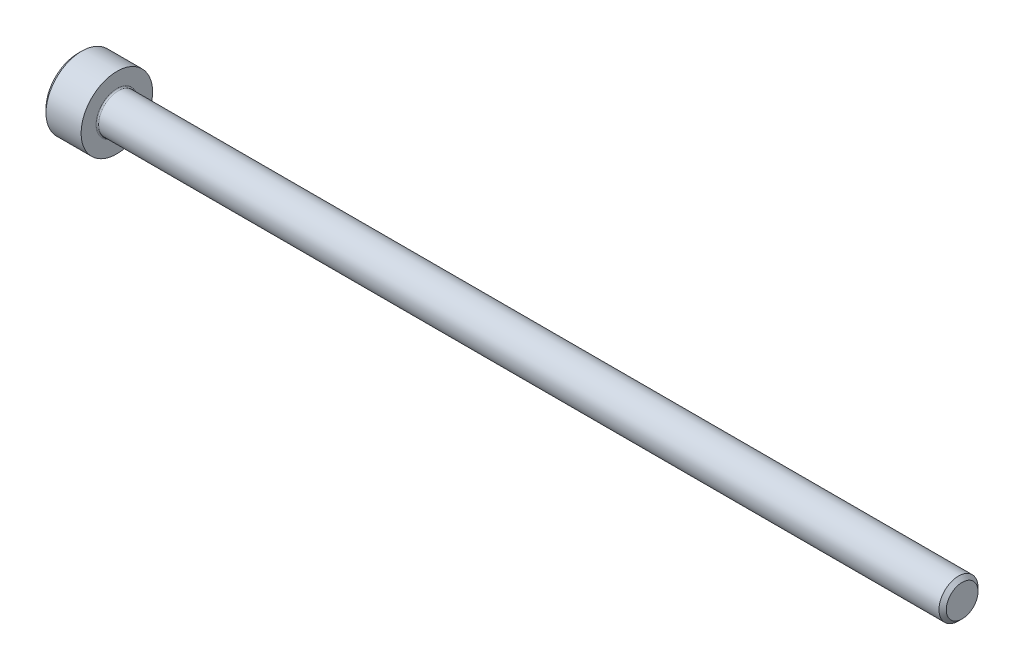
ISO-10303-21;
HEADER;
FILE_DESCRIPTION(('STEP AP214'),'2;1');
FILE_NAME('part.step','',(''),(''),'','','');
FILE_SCHEMA(('AUTOMOTIVE_DESIGN { 1 0 10303 214 1 1 1 1 }'));
ENDSEC;
DATA;
#1=APPLICATION_CONTEXT('core data for automotive mechanical design processes');
#2=APPLICATION_PROTOCOL_DEFINITION('international standard','automotive_design',2000,#1);
#3=PRODUCT_CONTEXT('',#1,'mechanical');
#4=PRODUCT('Part','Part','',(#3));
#5=PRODUCT_RELATED_PRODUCT_CATEGORY('part','',(#4));
#6=PRODUCT_DEFINITION_FORMATION('','',#4);
#7=PRODUCT_DEFINITION_CONTEXT('part definition',#1,'design');
#8=PRODUCT_DEFINITION('design','',#6,#7);
#9=PRODUCT_DEFINITION_SHAPE('','',#8);
#10=(LENGTH_UNIT() NAMED_UNIT(*) SI_UNIT(.MILLI.,.METRE.));
#11=(NAMED_UNIT(*) PLANE_ANGLE_UNIT() SI_UNIT($,.RADIAN.));
#12=(NAMED_UNIT(*) SI_UNIT($,.STERADIAN.) SOLID_ANGLE_UNIT());
#13=UNCERTAINTY_MEASURE_WITH_UNIT(LENGTH_MEASURE(1.E-05),#10,'distance_accuracy_value','');
#14=(GEOMETRIC_REPRESENTATION_CONTEXT(3) GLOBAL_UNCERTAINTY_ASSIGNED_CONTEXT((#13)) GLOBAL_UNIT_ASSIGNED_CONTEXT((#10,
#11,#12)) REPRESENTATION_CONTEXT('',''));
#15=CARTESIAN_POINT('',(0.,0.,0.));
#16=DIRECTION('',(0.,0.,1.));
#17=DIRECTION('',(1.,0.,0.));
#18=AXIS2_PLACEMENT_3D('',#15,#16,#17);
#19=CARTESIAN_POINT('',(0.,0.,0.));
#20=DIRECTION('',(-1.,0.,0.));
#21=DIRECTION('',(0.,0.,1.));
#22=AXIS2_PLACEMENT_3D('',#19,#20,#21);
#23=PLANE('',#22);
#24=DIRECTION('',(0.,-0.499999999999998,0.866025403784439));
#25=VECTOR('',#24,1.);
#26=CARTESIAN_POINT('',(0.,1.47801668912544,0.));
#27=LINE('',#26,#25);
#28=CARTESIAN_POINT('',(0.,1.47801668912544,0.));
#29=VERTEX_POINT('',#28);
#30=CARTESIAN_POINT('',(0.,0.739008344562719,1.28));
#31=VERTEX_POINT('',#30);
#32=EDGE_CURVE('E433',#29,#31,#27,.T.);
#33=ORIENTED_EDGE('',*,*,#32,.T.);
#34=DIRECTION('',(0.,1.,0.));
#35=VECTOR('',#34,1.);
#36=CARTESIAN_POINT('',(0.,-0.739008344562722,1.28));
#37=LINE('',#36,#35);
#38=CARTESIAN_POINT('',(0.,-0.739008344562722,1.28));
#39=VERTEX_POINT('',#38);
#40=EDGE_CURVE('E152',#39,#31,#37,.T.);
#41=ORIENTED_EDGE('',*,*,#40,.F.);
#42=DIRECTION('',(0.,-0.500000000000001,-0.866025403784438));
#43=VECTOR('',#42,1.);
#44=CARTESIAN_POINT('',(0.,-0.739008344562722,1.28));
#45=LINE('',#44,#43);
#46=CARTESIAN_POINT('',(0.,-1.47801668912544,0.));
#47=VERTEX_POINT('',#46);
#48=EDGE_CURVE('E438',#39,#47,#45,.T.);
#49=ORIENTED_EDGE('',*,*,#48,.T.);
#50=DIRECTION('',(0.,0.499999999999998,-0.86602540378444));
#51=VECTOR('',#50,1.);
#52=CARTESIAN_POINT('',(0.,-1.47801668912544,0.));
#53=LINE('',#52,#51);
#54=CARTESIAN_POINT('',(0.,-0.739008344562727,-1.28));
#55=VERTEX_POINT('',#54);
#56=EDGE_CURVE('E442',#47,#55,#53,.T.);
#57=ORIENTED_EDGE('',*,*,#56,.T.);
#58=DIRECTION('',(0.,-1.,0.));
#59=VECTOR('',#58,1.);
#60=CARTESIAN_POINT('',(0.,0.739008344562715,-1.28));
#61=LINE('',#60,#59);
#62=CARTESIAN_POINT('',(0.,0.739008344562715,-1.28));
#63=VERTEX_POINT('',#62);
#64=EDGE_CURVE('E446',#63,#55,#61,.T.);
#65=ORIENTED_EDGE('',*,*,#64,.F.);
#66=DIRECTION('',(0.,-0.500000000000001,-0.866025403784438));
#67=VECTOR('',#66,1.);
#68=CARTESIAN_POINT('',(0.,1.47801668912544,0.));
#69=LINE('',#68,#67);
#70=EDGE_CURVE('E147',#29,#63,#69,.T.);
#71=ORIENTED_EDGE('',*,*,#70,.F.);
#72=EDGE_LOOP('',(#33,#41,#49,#57,#65,#71));
#73=FACE_BOUND('',#72,.T.);
#74=CARTESIAN_POINT('',(0.,0.,0.));
#75=DIRECTION('',(-1.,0.,0.));
#76=DIRECTION('',(0.,0.,1.));
#77=AXIS2_PLACEMENT_3D('',#74,#75,#76);
#78=CIRCLE('',#77,2.45);
#79=CARTESIAN_POINT('',(0.,0.,2.45));
#80=VERTEX_POINT('',#79);
#81=EDGE_CURVE('E168',#80,#80,#78,.T.);
#82=ORIENTED_EDGE('',*,*,#81,.T.);
#83=EDGE_LOOP('',(#82));
#84=FACE_BOUND('',#83,.T.);
#85=ADVANCED_FACE('F38',(#73,#84),#23,.T.);
#86=CARTESIAN_POINT('',(68.,1.2195,0.));
#87=DIRECTION('',(1.,0.,0.));
#88=DIRECTION('',(0.,0.,-1.));
#89=AXIS2_PLACEMENT_3D('',#86,#87,#88);
#90=PLANE('',#89);
#91=CARTESIAN_POINT('',(68.,0.,0.));
#92=DIRECTION('',(-1.,0.,0.));
#93=DIRECTION('',(0.,0.,1.));
#94=AXIS2_PLACEMENT_3D('',#91,#92,#93);
#95=CIRCLE('',#94,1.2195);
#96=CARTESIAN_POINT('',(68.,0.,1.2195));
#97=VERTEX_POINT('',#96);
#98=EDGE_CURVE('E185',#97,#97,#95,.T.);
#99=ORIENTED_EDGE('',*,*,#98,.F.);
#100=EDGE_LOOP('',(#99));
#101=FACE_BOUND('',#100,.T.);
#102=ADVANCED_FACE('F207',(#101),#90,.T.);
#103=CARTESIAN_POINT('',(68.,0.,0.));
#104=DIRECTION('',(-1.,0.,0.));
#105=DIRECTION('',(0.,0.,1.));
#106=AXIS2_PLACEMENT_3D('',#103,#104,#105);
#107=CONICAL_SURFACE('',#106,1.2195,0.785398163396707);
#108=CARTESIAN_POINT('',(67.7194999999998,0.,0.));
#109=DIRECTION('',(-1.,0.,0.));
#110=DIRECTION('',(0.,0.,1.));
#111=AXIS2_PLACEMENT_3D('',#108,#109,#110);
#112=CIRCLE('',#111,1.49999999999978);
#113=CARTESIAN_POINT('',(67.7194999999998,0.,1.49999999999978));
#114=VERTEX_POINT('',#113);
#115=EDGE_CURVE('E181',#114,#114,#112,.T.);
#116=ORIENTED_EDGE('',*,*,#115,.F.);
#117=EDGE_LOOP('',(#116));
#118=FACE_BOUND('',#117,.T.);
#119=ORIENTED_EDGE('',*,*,#98,.T.);
#120=EDGE_LOOP('',(#119));
#121=FACE_BOUND('',#120,.T.);
#122=ADVANCED_FACE('F213',(#118,#121),#107,.T.);
#123=CARTESIAN_POINT('',(-31.75,0.,0.));
#124=DIRECTION('',(-1.,0.,0.));
#125=DIRECTION('',(0.,0.,1.));
#126=AXIS2_PLACEMENT_3D('',#123,#124,#125);
#127=CYLINDRICAL_SURFACE('',#126,1.49999999999989);
#128=CARTESIAN_POINT('',(3.1,0.,0.));
#129=DIRECTION('',(1.,0.,0.));
#130=DIRECTION('',(0.,0.,-1.));
#131=AXIS2_PLACEMENT_3D('',#128,#129,#130);
#132=CIRCLE('',#131,1.49999999999989);
#133=CARTESIAN_POINT('',(3.1,0.,-1.49999999999989));
#134=VERTEX_POINT('',#133);
#135=EDGE_CURVE('E11',#134,#134,#132,.T.);
#136=ORIENTED_EDGE('',*,*,#135,.T.);
#137=EDGE_LOOP('',(#136));
#138=FACE_BOUND('',#137,.T.);
#139=ORIENTED_EDGE('',*,*,#115,.T.);
#140=EDGE_LOOP('',(#139));
#141=FACE_BOUND('',#140,.T.);
#142=ADVANCED_FACE('F224',(#138,#141),#127,.T.);
#143=CARTESIAN_POINT('',(3.,2.75,0.));
#144=DIRECTION('',(1.,0.,0.));
#145=DIRECTION('',(0.,0.,-1.));
#146=AXIS2_PLACEMENT_3D('',#143,#144,#145);
#147=PLANE('',#146);
#148=CARTESIAN_POINT('',(3.,0.,0.));
#149=DIRECTION('',(1.,0.,0.));
#150=DIRECTION('',(0.,0.,-1.));
#151=AXIS2_PLACEMENT_3D('',#148,#149,#150);
#152=CIRCLE('',#151,1.59999999999989);
#153=CARTESIAN_POINT('',(3.,0.,-1.59999999999989));
#154=VERTEX_POINT('',#153);
#155=EDGE_CURVE('E47',#154,#154,#152,.F.);
#156=ORIENTED_EDGE('',*,*,#155,.T.);
#157=EDGE_LOOP('',(#156));
#158=FACE_BOUND('',#157,.T.);
#159=CARTESIAN_POINT('',(3.,0.,0.));
#160=DIRECTION('',(-1.,0.,0.));
#161=DIRECTION('',(0.,0.,1.));
#162=AXIS2_PLACEMENT_3D('',#159,#160,#161);
#163=CIRCLE('',#162,2.75);
#164=CARTESIAN_POINT('',(3.,0.,2.75));
#165=VERTEX_POINT('',#164);
#166=EDGE_CURVE('E177',#165,#165,#163,.T.);
#167=ORIENTED_EDGE('',*,*,#166,.F.);
#168=EDGE_LOOP('',(#167));
#169=FACE_BOUND('',#168,.T.);
#170=ADVANCED_FACE('F191',(#158,#169),#147,.T.);
#171=CARTESIAN_POINT('',(-31.75,0.,0.));
#172=DIRECTION('',(-1.,0.,0.));
#173=DIRECTION('',(0.,0.,1.));
#174=AXIS2_PLACEMENT_3D('',#171,#172,#173);
#175=CYLINDRICAL_SURFACE('',#174,2.75);
#176=ORIENTED_EDGE('',*,*,#166,.T.);
#177=EDGE_LOOP('',(#176));
#178=FACE_BOUND('',#177,.T.);
#179=CARTESIAN_POINT('',(0.300000000000002,0.,0.));
#180=DIRECTION('',(-1.,0.,0.));
#181=DIRECTION('',(0.,0.,1.));
#182=AXIS2_PLACEMENT_3D('',#179,#180,#181);
#183=CIRCLE('',#182,2.75);
#184=CARTESIAN_POINT('',(0.300000000000002,0.,2.75));
#185=VERTEX_POINT('',#184);
#186=EDGE_CURVE('E173',#185,#185,#183,.T.);
#187=ORIENTED_EDGE('',*,*,#186,.F.);
#188=EDGE_LOOP('',(#187));
#189=FACE_BOUND('',#188,.T.);
#190=ADVANCED_FACE('F202',(#178,#189),#175,.T.);
#191=CARTESIAN_POINT('',(0.,0.,0.));
#192=DIRECTION('',(1.,0.,0.));
#193=DIRECTION('',(0.,0.,-1.));
#194=AXIS2_PLACEMENT_3D('',#191,#192,#193);
#195=CONICAL_SURFACE('',#194,2.45,0.785398163397448);
#196=ORIENTED_EDGE('',*,*,#186,.T.);
#197=EDGE_LOOP('',(#196));
#198=FACE_BOUND('',#197,.T.);
#199=ORIENTED_EDGE('',*,*,#81,.F.);
#200=EDGE_LOOP('',(#199));
#201=FACE_BOUND('',#200,.T.);
#202=ADVANCED_FACE('F195',(#198,#201),#195,.T.);
#203=CARTESIAN_POINT('',(3.1,0.,0.));
#204=DIRECTION('',(1.,0.,0.));
#205=DIRECTION('',(0.,0.,-1.));
#206=AXIS2_PLACEMENT_3D('',#203,#204,#205);
#207=TOROIDAL_SURFACE('',#206,1.59999999999989,0.1);
#208=ORIENTED_EDGE('',*,*,#135,.F.);
#209=EDGE_LOOP('',(#208));
#210=FACE_BOUND('',#209,.T.);
#211=ORIENTED_EDGE('',*,*,#155,.F.);
#212=EDGE_LOOP('',(#211));
#213=FACE_BOUND('',#212,.T.);
#214=ADVANCED_FACE('F40',(#210,#213),#207,.F.);
#215=CARTESIAN_POINT('',(1.3,1.47801668912544,0.));
#216=DIRECTION('',(0.,-0.86602540378444,-0.499999999999999));
#217=DIRECTION('',(0.,0.499999999999999,-0.86602540378444));
#218=AXIS2_PLACEMENT_3D('',#215,#216,#217);
#219=PLANE('',#218);
#220=ORIENTED_EDGE('',*,*,#32,.F.);
#221=DIRECTION('',(-1.,0.,0.));
#222=VECTOR('',#221,1.);
#223=CARTESIAN_POINT('',(1.3,1.47801668912544,0.));
#224=LINE('',#223,#222);
#225=CARTESIAN_POINT('',(1.3,1.47801668912544,0.));
#226=VERTEX_POINT('',#225);
#227=EDGE_CURVE('E432',#226,#29,#224,.T.);
#228=ORIENTED_EDGE('',*,*,#227,.F.);
#229=DIRECTION('',(0.,-0.499999999999998,0.866025403784439));
#230=VECTOR('',#229,1.);
#231=CARTESIAN_POINT('',(1.3,1.47801668912544,0.));
#232=LINE('',#231,#230);
#233=CARTESIAN_POINT('',(1.3,1.10851251684408,0.639999999999998));
#234=VERTEX_POINT('',#233);
#235=EDGE_CURVE('E57',#226,#234,#232,.T.);
#236=ORIENTED_EDGE('',*,*,#235,.T.);
#237=CARTESIAN_POINT('',(1.3,0.739008344562719,1.28));
#238=VERTEX_POINT('',#237);
#239=EDGE_CURVE('E131',#234,#238,#232,.T.);
#240=ORIENTED_EDGE('',*,*,#239,.T.);
#241=DIRECTION('',(-1.,0.,0.));
#242=VECTOR('',#241,1.);
#243=CARTESIAN_POINT('',(1.3,0.739008344562719,1.28));
#244=LINE('',#243,#242);
#245=EDGE_CURVE('E144',#238,#31,#244,.T.);
#246=ORIENTED_EDGE('',*,*,#245,.T.);
#247=EDGE_LOOP('',(#220,#228,#236,#240,#246));
#248=FACE_BOUND('',#247,.T.);
#249=ADVANCED_FACE('F143',(#248),#219,.T.);
#250=CARTESIAN_POINT('',(1.3,-0.739008344562722,1.28));
#251=DIRECTION('',(0.,0.,1.));
#252=DIRECTION('',(0.,-1.,0.));
#253=AXIS2_PLACEMENT_3D('',#250,#251,#252);
#254=PLANE('',#253);
#255=ORIENTED_EDGE('',*,*,#40,.T.);
#256=ORIENTED_EDGE('',*,*,#245,.F.);
#257=DIRECTION('',(0.,1.,0.));
#258=VECTOR('',#257,1.);
#259=CARTESIAN_POINT('',(1.3,-0.739008344562722,1.28));
#260=LINE('',#259,#258);
#261=CARTESIAN_POINT('',(1.3,0.,1.28));
#262=VERTEX_POINT('',#261);
#263=EDGE_CURVE('E129',#262,#238,#260,.T.);
#264=ORIENTED_EDGE('',*,*,#263,.F.);
#265=CARTESIAN_POINT('',(1.3,-0.739008344562722,1.28));
#266=VERTEX_POINT('',#265);
#267=EDGE_CURVE('E140',#266,#262,#260,.T.);
#268=ORIENTED_EDGE('',*,*,#267,.F.);
#269=DIRECTION('',(-1.,0.,0.));
#270=VECTOR('',#269,1.);
#271=CARTESIAN_POINT('',(1.3,-0.739008344562722,1.28));
#272=LINE('',#271,#270);
#273=EDGE_CURVE('E155',#266,#39,#272,.T.);
#274=ORIENTED_EDGE('',*,*,#273,.T.);
#275=EDGE_LOOP('',(#255,#256,#264,#268,#274));
#276=FACE_BOUND('',#275,.T.);
#277=ADVANCED_FACE('F149',(#276),#254,.F.);
#278=CARTESIAN_POINT('',(1.3,-0.739008344562722,1.28));
#279=DIRECTION('',(0.,0.866025403784438,-0.500000000000001));
#280=DIRECTION('',(0.,0.500000000000001,0.866025403784438));
#281=AXIS2_PLACEMENT_3D('',#278,#279,#280);
#282=PLANE('',#281);
#283=ORIENTED_EDGE('',*,*,#48,.F.);
#284=ORIENTED_EDGE('',*,*,#273,.F.);
#285=DIRECTION('',(0.,-0.500000000000001,-0.866025403784438));
#286=VECTOR('',#285,1.);
#287=CARTESIAN_POINT('',(1.3,-0.739008344562722,1.28));
#288=LINE('',#287,#286);
#289=CARTESIAN_POINT('',(1.3,-1.10851251684408,0.640000000000002));
#290=VERTEX_POINT('',#289);
#291=EDGE_CURVE('E407',#266,#290,#288,.T.);
#292=ORIENTED_EDGE('',*,*,#291,.T.);
#293=CARTESIAN_POINT('',(1.3,-1.47801668912544,0.));
#294=VERTEX_POINT('',#293);
#295=EDGE_CURVE('E409',#290,#294,#288,.T.);
#296=ORIENTED_EDGE('',*,*,#295,.T.);
#297=DIRECTION('',(-1.,0.,0.));
#298=VECTOR('',#297,1.);
#299=CARTESIAN_POINT('',(1.3,-1.47801668912544,0.));
#300=LINE('',#299,#298);
#301=EDGE_CURVE('E163',#294,#47,#300,.T.);
#302=ORIENTED_EDGE('',*,*,#301,.T.);
#303=EDGE_LOOP('',(#283,#284,#292,#296,#302));
#304=FACE_BOUND('',#303,.T.);
#305=ADVANCED_FACE('F298',(#304),#282,.T.);
#306=CARTESIAN_POINT('',(1.3,-1.47801668912544,0.));
#307=DIRECTION('',(0.,0.86602540378444,0.499999999999998));
#308=DIRECTION('',(0.,-0.499999999999998,0.86602540378444));
#309=AXIS2_PLACEMENT_3D('',#306,#307,#308);
#310=PLANE('',#309);
#311=ORIENTED_EDGE('',*,*,#56,.F.);
#312=ORIENTED_EDGE('',*,*,#301,.F.);
#313=DIRECTION('',(0.,0.499999999999998,-0.86602540378444));
#314=VECTOR('',#313,1.);
#315=CARTESIAN_POINT('',(1.3,-1.47801668912544,0.));
#316=LINE('',#315,#314);
#317=CARTESIAN_POINT('',(1.3,-1.10851251684409,-0.639999999999999));
#318=VERTEX_POINT('',#317);
#319=EDGE_CURVE('E412',#294,#318,#316,.T.);
#320=ORIENTED_EDGE('',*,*,#319,.T.);
#321=CARTESIAN_POINT('',(1.3,-0.739008344562727,-1.28));
#322=VERTEX_POINT('',#321);
#323=EDGE_CURVE('E418',#318,#322,#316,.T.);
#324=ORIENTED_EDGE('',*,*,#323,.T.);
#325=DIRECTION('',(-1.,0.,0.));
#326=VECTOR('',#325,1.);
#327=CARTESIAN_POINT('',(1.3,-0.739008344562727,-1.28));
#328=LINE('',#327,#326);
#329=EDGE_CURVE('E459',#322,#55,#328,.T.);
#330=ORIENTED_EDGE('',*,*,#329,.T.);
#331=EDGE_LOOP('',(#311,#312,#320,#324,#330));
#332=FACE_BOUND('',#331,.T.);
#333=ADVANCED_FACE('F306',(#332),#310,.T.);
#334=CARTESIAN_POINT('',(1.3,0.739008344562715,-1.28));
#335=DIRECTION('',(0.,0.,-1.));
#336=DIRECTION('',(0.,1.,0.));
#337=AXIS2_PLACEMENT_3D('',#334,#335,#336);
#338=PLANE('',#337);
#339=ORIENTED_EDGE('',*,*,#64,.T.);
#340=ORIENTED_EDGE('',*,*,#329,.F.);
#341=DIRECTION('',(0.,-1.,0.));
#342=VECTOR('',#341,1.);
#343=CARTESIAN_POINT('',(1.3,0.739008344562715,-1.28));
#344=LINE('',#343,#342);
#345=CARTESIAN_POINT('',(1.3,0.,-1.28));
#346=VERTEX_POINT('',#345);
#347=EDGE_CURVE('E424',#346,#322,#344,.T.);
#348=ORIENTED_EDGE('',*,*,#347,.F.);
#349=CARTESIAN_POINT('',(1.3,0.739008344562715,-1.28));
#350=VERTEX_POINT('',#349);
#351=EDGE_CURVE('E425',#350,#346,#344,.T.);
#352=ORIENTED_EDGE('',*,*,#351,.F.);
#353=DIRECTION('',(-1.,0.,0.));
#354=VECTOR('',#353,1.);
#355=CARTESIAN_POINT('',(1.3,0.739008344562715,-1.28));
#356=LINE('',#355,#354);
#357=EDGE_CURVE('E455',#350,#63,#356,.T.);
#358=ORIENTED_EDGE('',*,*,#357,.T.);
#359=EDGE_LOOP('',(#339,#340,#348,#352,#358));
#360=FACE_BOUND('',#359,.T.);
#361=ADVANCED_FACE('F315',(#360),#338,.F.);
#362=CARTESIAN_POINT('',(1.3,1.47801668912544,0.));
#363=DIRECTION('',(0.,0.866025403784438,-0.500000000000001));
#364=DIRECTION('',(0.,0.500000000000001,0.866025403784438));
#365=AXIS2_PLACEMENT_3D('',#362,#363,#364);
#366=PLANE('',#365);
#367=ORIENTED_EDGE('',*,*,#70,.T.);
#368=ORIENTED_EDGE('',*,*,#357,.F.);
#369=DIRECTION('',(0.,-0.500000000000001,-0.866025403784438));
#370=VECTOR('',#369,1.);
#371=CARTESIAN_POINT('',(1.3,1.47801668912544,0.));
#372=LINE('',#371,#370);
#373=CARTESIAN_POINT('',(1.3,1.10851251684408,-0.64));
#374=VERTEX_POINT('',#373);
#375=EDGE_CURVE('E429',#374,#350,#372,.T.);
#376=ORIENTED_EDGE('',*,*,#375,.F.);
#377=EDGE_CURVE('E397',#226,#374,#372,.T.);
#378=ORIENTED_EDGE('',*,*,#377,.F.);
#379=ORIENTED_EDGE('',*,*,#227,.T.);
#380=EDGE_LOOP('',(#367,#368,#376,#378,#379));
#381=FACE_BOUND('',#380,.T.);
#382=ADVANCED_FACE('F324',(#381),#366,.F.);
#383=CARTESIAN_POINT('',(1.3,0.739008344562718,1.28));
#384=DIRECTION('',(-1.,0.,0.));
#385=DIRECTION('',(0.,0.,1.));
#386=AXIS2_PLACEMENT_3D('',#383,#384,#385);
#387=PLANE('',#386);
#388=CARTESIAN_POINT('',(1.3,0.,0.));
#389=DIRECTION('',(-1.,0.,0.));
#390=DIRECTION('',(0.,0.,1.));
#391=AXIS2_PLACEMENT_3D('',#388,#389,#390);
#392=CIRCLE('',#391,1.28);
#393=EDGE_CURVE('E154',#290,#262,#392,.T.);
#394=ORIENTED_EDGE('',*,*,#393,.F.);
#395=ORIENTED_EDGE('',*,*,#291,.F.);
#396=ORIENTED_EDGE('',*,*,#267,.T.);
#397=EDGE_LOOP('',(#394,#395,#396));
#398=FACE_BOUND('',#397,.T.);
#399=ADVANCED_FACE('F333',(#398),#387,.T.);
#400=EDGE_CURVE('E160',#318,#290,#392,.T.);
#401=ORIENTED_EDGE('',*,*,#400,.F.);
#402=ORIENTED_EDGE('',*,*,#319,.F.);
#403=ORIENTED_EDGE('',*,*,#295,.F.);
#404=EDGE_LOOP('',(#401,#402,#403));
#405=FACE_BOUND('',#404,.T.);
#406=ADVANCED_FACE('F342',(#405),#387,.T.);
#407=EDGE_CURVE('E470',#346,#318,#392,.T.);
#408=ORIENTED_EDGE('',*,*,#407,.F.);
#409=ORIENTED_EDGE('',*,*,#347,.T.);
#410=ORIENTED_EDGE('',*,*,#323,.F.);
#411=EDGE_LOOP('',(#408,#409,#410));
#412=FACE_BOUND('',#411,.T.);
#413=ADVANCED_FACE('F351',(#412),#387,.T.);
#414=EDGE_CURVE('E401',#374,#346,#392,.T.);
#415=ORIENTED_EDGE('',*,*,#414,.F.);
#416=ORIENTED_EDGE('',*,*,#375,.T.);
#417=ORIENTED_EDGE('',*,*,#351,.T.);
#418=EDGE_LOOP('',(#415,#416,#417));
#419=FACE_BOUND('',#418,.T.);
#420=ADVANCED_FACE('F359',(#419),#387,.T.);
#421=EDGE_CURVE('E169',#234,#374,#392,.T.);
#422=ORIENTED_EDGE('',*,*,#421,.F.);
#423=ORIENTED_EDGE('',*,*,#235,.F.);
#424=ORIENTED_EDGE('',*,*,#377,.T.);
#425=EDGE_LOOP('',(#422,#423,#424));
#426=FACE_BOUND('',#425,.T.);
#427=ADVANCED_FACE('F367',(#426),#387,.T.);
#428=EDGE_CURVE('E134',#262,#234,#392,.T.);
#429=ORIENTED_EDGE('',*,*,#428,.F.);
#430=ORIENTED_EDGE('',*,*,#263,.T.);
#431=ORIENTED_EDGE('',*,*,#239,.F.);
#432=EDGE_LOOP('',(#429,#430,#431));
#433=FACE_BOUND('',#432,.T.);
#434=ADVANCED_FACE('F130',(#433),#387,.T.);
#435=CARTESIAN_POINT('',(1.3,0.,0.));
#436=DIRECTION('',(-1.,0.,0.));
#437=DIRECTION('',(0.,0.,1.));
#438=AXIS2_PLACEMENT_3D('',#435,#436,#437);
#439=CONICAL_SURFACE('',#438,1.28,1.0471975511966);
#440=CARTESIAN_POINT('',(2.03900834456273,0.,0.));
#441=VERTEX_POINT('',#440);
#442=VERTEX_LOOP('',#441);
#443=FACE_BOUND('',#442,.T.);
#444=ORIENTED_EDGE('',*,*,#428,.T.);
#445=ORIENTED_EDGE('',*,*,#421,.T.);
#446=ORIENTED_EDGE('',*,*,#414,.T.);
#447=ORIENTED_EDGE('',*,*,#407,.T.);
#448=ORIENTED_EDGE('',*,*,#400,.T.);
#449=ORIENTED_EDGE('',*,*,#393,.T.);
#450=EDGE_LOOP('',(#444,#445,#446,#447,#448,#449));
#451=FACE_BOUND('',#450,.T.);
#452=ADVANCED_FACE('F217',(#443,#451),#439,.F.);
#453=CLOSED_SHELL('',(#85,#102,#122,#142,#170,#190,#202,#214,#249,#277,#305,#333,#361,#382,#399,
#406,#413,#420,#427,#434,#452));
#454=MANIFOLD_SOLID_BREP('B2',#453);
#455=ADVANCED_BREP_SHAPE_REPRESENTATION('',(#18,#454),#14);
#456=SHAPE_DEFINITION_REPRESENTATION(#9,#455);
ENDSEC;
END-ISO-10303-21;
